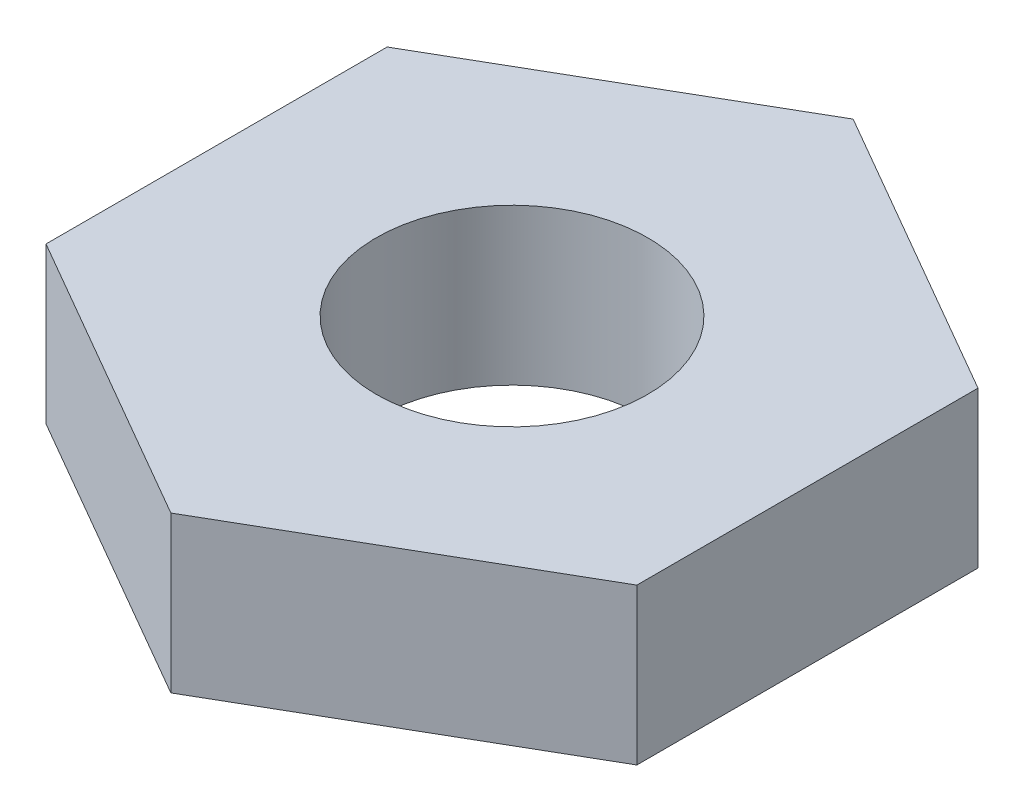
ISO-10303-21;
HEADER;
FILE_DESCRIPTION(('STEP AP214'),'2;1');
FILE_NAME('part.step','',(''),(''),'','','');
FILE_SCHEMA(('AUTOMOTIVE_DESIGN { 1 0 10303 214 1 1 1 1 }'));
ENDSEC;
DATA;
#1=APPLICATION_CONTEXT('core data for automotive mechanical design processes');
#2=APPLICATION_PROTOCOL_DEFINITION('international standard','automotive_design',2000,#1);
#3=PRODUCT_CONTEXT('',#1,'mechanical');
#4=PRODUCT('Part','Part','',(#3));
#5=PRODUCT_RELATED_PRODUCT_CATEGORY('part','',(#4));
#6=PRODUCT_DEFINITION_FORMATION('','',#4);
#7=PRODUCT_DEFINITION_CONTEXT('part definition',#1,'design');
#8=PRODUCT_DEFINITION('design','',#6,#7);
#9=PRODUCT_DEFINITION_SHAPE('','',#8);
#10=(LENGTH_UNIT() NAMED_UNIT(*) SI_UNIT(.MILLI.,.METRE.));
#11=(NAMED_UNIT(*) PLANE_ANGLE_UNIT() SI_UNIT($,.RADIAN.));
#12=(NAMED_UNIT(*) SI_UNIT($,.STERADIAN.) SOLID_ANGLE_UNIT());
#13=UNCERTAINTY_MEASURE_WITH_UNIT(LENGTH_MEASURE(1.E-05),#10,'distance_accuracy_value','');
#14=(GEOMETRIC_REPRESENTATION_CONTEXT(3) GLOBAL_UNCERTAINTY_ASSIGNED_CONTEXT((#13)) GLOBAL_UNIT_ASSIGNED_CONTEXT((#10,
#11,#12)) REPRESENTATION_CONTEXT('',''));
#15=CARTESIAN_POINT('',(0.,0.,0.));
#16=DIRECTION('',(0.,0.,1.));
#17=DIRECTION('',(1.,0.,0.));
#18=AXIS2_PLACEMENT_3D('',#15,#16,#17);
#19=CARTESIAN_POINT('',(0.,1.6764,0.));
#20=DIRECTION('',(0.,-1.,0.));
#21=DIRECTION('',(0.,0.,-1.));
#22=AXIS2_PLACEMENT_3D('',#19,#20,#21);
#23=PLANE('',#22);
#24=DIRECTION('',(0.,0.,-1.));
#25=VECTOR('',#24,1.);
#26=CARTESIAN_POINT('',(3.17857303951003,1.6764,-1.83514999999999));
#27=LINE('',#26,#25);
#28=CARTESIAN_POINT('',(3.17857303951002,1.6764,1.83515000000002));
#29=VERTEX_POINT('',#28);
#30=CARTESIAN_POINT('',(3.17857303951003,1.6764,-1.83514999999999));
#31=VERTEX_POINT('',#30);
#32=EDGE_CURVE('E129',#29,#31,#27,.T.);
#33=ORIENTED_EDGE('',*,*,#32,.T.);
#34=DIRECTION('',(-0.866025403784438,0.,-0.500000000000001));
#35=VECTOR('',#34,1.);
#36=CARTESIAN_POINT('',(0.,1.6764,-3.6703));
#37=LINE('',#36,#35);
#38=CARTESIAN_POINT('',(0.,1.6764,-3.6703));
#39=VERTEX_POINT('',#38);
#40=EDGE_CURVE('E87',#31,#39,#37,.T.);
#41=ORIENTED_EDGE('',*,*,#40,.T.);
#42=DIRECTION('',(-0.866025403784441,0.,0.499999999999995));
#43=VECTOR('',#42,1.);
#44=CARTESIAN_POINT('',(-3.17857303951,1.6764,-1.83515000000004));
#45=LINE('',#44,#43);
#46=CARTESIAN_POINT('',(-3.17857303951,1.6764,-1.83515000000004));
#47=VERTEX_POINT('',#46);
#48=EDGE_CURVE('E100',#39,#47,#45,.T.);
#49=ORIENTED_EDGE('',*,*,#48,.T.);
#50=DIRECTION('',(0.,0.,1.));
#51=VECTOR('',#50,1.);
#52=CARTESIAN_POINT('',(-3.17857303951004,1.6764,1.83514999999997));
#53=LINE('',#52,#51);
#54=CARTESIAN_POINT('',(-3.17857303951004,1.6764,1.83514999999997));
#55=VERTEX_POINT('',#54);
#56=EDGE_CURVE('E94',#47,#55,#53,.T.);
#57=ORIENTED_EDGE('',*,*,#56,.T.);
#58=DIRECTION('',(0.866025403784434,0.,0.500000000000007));
#59=VECTOR('',#58,1.);
#60=CARTESIAN_POINT('',(0.,1.6764,3.6703));
#61=LINE('',#60,#59);
#62=CARTESIAN_POINT('',(0.,1.6764,3.6703));
#63=VERTEX_POINT('',#62);
#64=EDGE_CURVE('E98',#55,#63,#61,.T.);
#65=ORIENTED_EDGE('',*,*,#64,.T.);
#66=DIRECTION('',(0.866025403784442,0.,-0.499999999999995));
#67=VECTOR('',#66,1.);
#68=CARTESIAN_POINT('',(3.17857303951002,1.6764,1.83515000000002));
#69=LINE('',#68,#67);
#70=EDGE_CURVE('E50',#63,#29,#69,.T.);
#71=ORIENTED_EDGE('',*,*,#70,.T.);
#72=EDGE_LOOP('',(#33,#41,#49,#57,#65,#71));
#73=FACE_BOUND('',#72,.T.);
#74=CARTESIAN_POINT('',(0.,1.6764,0.));
#75=DIRECTION('',(0.,1.,0.));
#76=DIRECTION('',(0.,0.,1.));
#77=AXIS2_PLACEMENT_3D('',#74,#75,#76);
#78=CIRCLE('',#77,1.4605);
#79=CARTESIAN_POINT('',(0.,1.6764,1.4605));
#80=VERTEX_POINT('',#79);
#81=EDGE_CURVE('E122',#80,#80,#78,.T.);
#82=ORIENTED_EDGE('',*,*,#81,.F.);
#83=EDGE_LOOP('',(#82));
#84=FACE_BOUND('',#83,.T.);
#85=ADVANCED_FACE('F33',(#73,#84),#23,.F.);
#86=CARTESIAN_POINT('',(0.,0.,0.));
#87=DIRECTION('',(0.,-1.,0.));
#88=DIRECTION('',(0.,0.,-1.));
#89=AXIS2_PLACEMENT_3D('',#86,#87,#88);
#90=PLANE('',#89);
#91=DIRECTION('',(0.,0.,-1.));
#92=VECTOR('',#91,1.);
#93=CARTESIAN_POINT('',(3.17857303951003,0.,-1.83514999999999));
#94=LINE('',#93,#92);
#95=CARTESIAN_POINT('',(3.17857303951002,0.,1.83515000000002));
#96=VERTEX_POINT('',#95);
#97=CARTESIAN_POINT('',(3.17857303951003,0.,-1.83514999999999));
#98=VERTEX_POINT('',#97);
#99=EDGE_CURVE('E118',#96,#98,#94,.T.);
#100=ORIENTED_EDGE('',*,*,#99,.F.);
#101=DIRECTION('',(0.866025403784442,0.,-0.499999999999995));
#102=VECTOR('',#101,1.);
#103=CARTESIAN_POINT('',(3.17857303951002,0.,1.83515000000002));
#104=LINE('',#103,#102);
#105=CARTESIAN_POINT('',(0.,0.,3.6703));
#106=VERTEX_POINT('',#105);
#107=EDGE_CURVE('E79',#106,#96,#104,.T.);
#108=ORIENTED_EDGE('',*,*,#107,.F.);
#109=DIRECTION('',(0.866025403784434,0.,0.500000000000007));
#110=VECTOR('',#109,1.);
#111=CARTESIAN_POINT('',(0.,0.,3.6703));
#112=LINE('',#111,#110);
#113=CARTESIAN_POINT('',(-3.17857303951004,0.,1.83514999999997));
#114=VERTEX_POINT('',#113);
#115=EDGE_CURVE('E73',#114,#106,#112,.T.);
#116=ORIENTED_EDGE('',*,*,#115,.F.);
#117=DIRECTION('',(0.,0.,1.));
#118=VECTOR('',#117,1.);
#119=CARTESIAN_POINT('',(-3.17857303951004,0.,1.83514999999997));
#120=LINE('',#119,#118);
#121=CARTESIAN_POINT('',(-3.17857303951,0.,-1.83515000000004));
#122=VERTEX_POINT('',#121);
#123=EDGE_CURVE('E108',#122,#114,#120,.T.);
#124=ORIENTED_EDGE('',*,*,#123,.F.);
#125=DIRECTION('',(-0.866025403784441,0.,0.499999999999995));
#126=VECTOR('',#125,1.);
#127=CARTESIAN_POINT('',(-3.17857303951,0.,-1.83515000000004));
#128=LINE('',#127,#126);
#129=CARTESIAN_POINT('',(0.,0.,-3.6703));
#130=VERTEX_POINT('',#129);
#131=EDGE_CURVE('E124',#130,#122,#128,.T.);
#132=ORIENTED_EDGE('',*,*,#131,.F.);
#133=DIRECTION('',(-0.866025403784438,0.,-0.500000000000001));
#134=VECTOR('',#133,1.);
#135=CARTESIAN_POINT('',(0.,0.,-3.6703));
#136=LINE('',#135,#134);
#137=EDGE_CURVE('E121',#98,#130,#136,.T.);
#138=ORIENTED_EDGE('',*,*,#137,.F.);
#139=EDGE_LOOP('',(#100,#108,#116,#124,#132,#138));
#140=FACE_BOUND('',#139,.T.);
#141=CARTESIAN_POINT('',(0.,0.,0.));
#142=DIRECTION('',(0.,1.,0.));
#143=DIRECTION('',(0.,0.,1.));
#144=AXIS2_PLACEMENT_3D('',#141,#142,#143);
#145=CIRCLE('',#144,1.4605);
#146=CARTESIAN_POINT('',(0.,0.,1.4605));
#147=VERTEX_POINT('',#146);
#148=EDGE_CURVE('E222',#147,#147,#145,.T.);
#149=ORIENTED_EDGE('',*,*,#148,.T.);
#150=EDGE_LOOP('',(#149));
#151=FACE_BOUND('',#150,.T.);
#152=ADVANCED_FACE('F138',(#140,#151),#90,.T.);
#153=CARTESIAN_POINT('',(3.17857303951003,1.6764,-1.83514999999999));
#154=DIRECTION('',(-1.,0.,0.));
#155=DIRECTION('',(0.,0.,1.));
#156=AXIS2_PLACEMENT_3D('',#153,#154,#155);
#157=PLANE('',#156);
#158=ORIENTED_EDGE('',*,*,#99,.T.);
#159=DIRECTION('',(0.,-1.,0.));
#160=VECTOR('',#159,1.);
#161=CARTESIAN_POINT('',(3.17857303951003,1.6764,-1.83514999999999));
#162=LINE('',#161,#160);
#163=EDGE_CURVE('E11',#31,#98,#162,.T.);
#164=ORIENTED_EDGE('',*,*,#163,.F.);
#165=ORIENTED_EDGE('',*,*,#32,.F.);
#166=DIRECTION('',(0.,-1.,0.));
#167=VECTOR('',#166,1.);
#168=CARTESIAN_POINT('',(3.17857303951002,1.6764,1.83515000000002));
#169=LINE('',#168,#167);
#170=EDGE_CURVE('E114',#29,#96,#169,.T.);
#171=ORIENTED_EDGE('',*,*,#170,.T.);
#172=EDGE_LOOP('',(#158,#164,#165,#171));
#173=FACE_BOUND('',#172,.T.);
#174=ADVANCED_FACE('F35',(#173),#157,.F.);
#175=CARTESIAN_POINT('',(0.,1.6764,-3.6703));
#176=DIRECTION('',(-0.500000000000001,0.,0.866025403784438));
#177=DIRECTION('',(0.866025403784438,0.,0.500000000000001));
#178=AXIS2_PLACEMENT_3D('',#175,#176,#177);
#179=PLANE('',#178);
#180=ORIENTED_EDGE('',*,*,#137,.T.);
#181=DIRECTION('',(0.,-1.,0.));
#182=VECTOR('',#181,1.);
#183=CARTESIAN_POINT('',(0.,1.6764,-3.6703));
#184=LINE('',#183,#182);
#185=EDGE_CURVE('E42',#39,#130,#184,.T.);
#186=ORIENTED_EDGE('',*,*,#185,.F.);
#187=ORIENTED_EDGE('',*,*,#40,.F.);
#188=ORIENTED_EDGE('',*,*,#163,.T.);
#189=EDGE_LOOP('',(#180,#186,#187,#188));
#190=FACE_BOUND('',#189,.T.);
#191=ADVANCED_FACE('F163',(#190),#179,.F.);
#192=CARTESIAN_POINT('',(-3.17857303951,1.6764,-1.83515000000004));
#193=DIRECTION('',(0.499999999999995,0.,0.866025403784441));
#194=DIRECTION('',(0.866025403784442,0.,-0.499999999999995));
#195=AXIS2_PLACEMENT_3D('',#192,#193,#194);
#196=PLANE('',#195);
#197=ORIENTED_EDGE('',*,*,#131,.T.);
#198=DIRECTION('',(0.,-1.,0.));
#199=VECTOR('',#198,1.);
#200=CARTESIAN_POINT('',(-3.17857303951,1.6764,-1.83515000000004));
#201=LINE('',#200,#199);
#202=EDGE_CURVE('E109',#47,#122,#201,.T.);
#203=ORIENTED_EDGE('',*,*,#202,.F.);
#204=ORIENTED_EDGE('',*,*,#48,.F.);
#205=ORIENTED_EDGE('',*,*,#185,.T.);
#206=EDGE_LOOP('',(#197,#203,#204,#205));
#207=FACE_BOUND('',#206,.T.);
#208=ADVANCED_FACE('F135',(#207),#196,.F.);
#209=CARTESIAN_POINT('',(-3.17857303951004,1.6764,1.83514999999997));
#210=DIRECTION('',(1.,0.,0.));
#211=DIRECTION('',(0.,0.,-1.));
#212=AXIS2_PLACEMENT_3D('',#209,#210,#211);
#213=PLANE('',#212);
#214=ORIENTED_EDGE('',*,*,#123,.T.);
#215=DIRECTION('',(0.,-1.,0.));
#216=VECTOR('',#215,1.);
#217=CARTESIAN_POINT('',(-3.17857303951004,1.6764,1.83514999999997));
#218=LINE('',#217,#216);
#219=EDGE_CURVE('E105',#55,#114,#218,.T.);
#220=ORIENTED_EDGE('',*,*,#219,.F.);
#221=ORIENTED_EDGE('',*,*,#56,.F.);
#222=ORIENTED_EDGE('',*,*,#202,.T.);
#223=EDGE_LOOP('',(#214,#220,#221,#222));
#224=FACE_BOUND('',#223,.T.);
#225=ADVANCED_FACE('F106',(#224),#213,.F.);
#226=CARTESIAN_POINT('',(0.,1.6764,3.6703));
#227=DIRECTION('',(0.500000000000007,0.,-0.866025403784434));
#228=DIRECTION('',(-0.866025403784434,0.,-0.500000000000007));
#229=AXIS2_PLACEMENT_3D('',#226,#227,#228);
#230=PLANE('',#229);
#231=ORIENTED_EDGE('',*,*,#115,.T.);
#232=DIRECTION('',(0.,-1.,0.));
#233=VECTOR('',#232,1.);
#234=CARTESIAN_POINT('',(0.,1.6764,3.6703));
#235=LINE('',#234,#233);
#236=EDGE_CURVE('E110',#63,#106,#235,.T.);
#237=ORIENTED_EDGE('',*,*,#236,.F.);
#238=ORIENTED_EDGE('',*,*,#64,.F.);
#239=ORIENTED_EDGE('',*,*,#219,.T.);
#240=EDGE_LOOP('',(#231,#237,#238,#239));
#241=FACE_BOUND('',#240,.T.);
#242=ADVANCED_FACE('F112',(#241),#230,.F.);
#243=CARTESIAN_POINT('',(3.17857303951002,1.6764,1.83515000000002));
#244=DIRECTION('',(-0.499999999999995,0.,-0.866025403784442));
#245=DIRECTION('',(-0.866025403784442,0.,0.499999999999995));
#246=AXIS2_PLACEMENT_3D('',#243,#244,#245);
#247=PLANE('',#246);
#248=ORIENTED_EDGE('',*,*,#107,.T.);
#249=ORIENTED_EDGE('',*,*,#170,.F.);
#250=ORIENTED_EDGE('',*,*,#70,.F.);
#251=ORIENTED_EDGE('',*,*,#236,.T.);
#252=EDGE_LOOP('',(#248,#249,#250,#251));
#253=FACE_BOUND('',#252,.T.);
#254=ADVANCED_FACE('F143',(#253),#247,.F.);
#255=CARTESIAN_POINT('',(0.,1.6764,0.));
#256=DIRECTION('',(0.,-1.,0.));
#257=DIRECTION('',(0.,0.,-1.));
#258=AXIS2_PLACEMENT_3D('',#255,#256,#257);
#259=CYLINDRICAL_SURFACE('',#258,1.4605);
#260=ORIENTED_EDGE('',*,*,#81,.T.);
#261=EDGE_LOOP('',(#260));
#262=FACE_BOUND('',#261,.T.);
#263=ORIENTED_EDGE('',*,*,#148,.F.);
#264=EDGE_LOOP('',(#263));
#265=FACE_BOUND('',#264,.T.);
#266=ADVANCED_FACE('F145',(#262,#265),#259,.F.);
#267=CLOSED_SHELL('',(#85,#152,#174,#191,#208,#225,#242,#254,#266));
#268=MANIFOLD_SOLID_BREP('B2',#267);
#269=ADVANCED_BREP_SHAPE_REPRESENTATION('',(#18,#268),#14);
#270=SHAPE_DEFINITION_REPRESENTATION(#9,#269);
ENDSEC;
END-ISO-10303-21;
